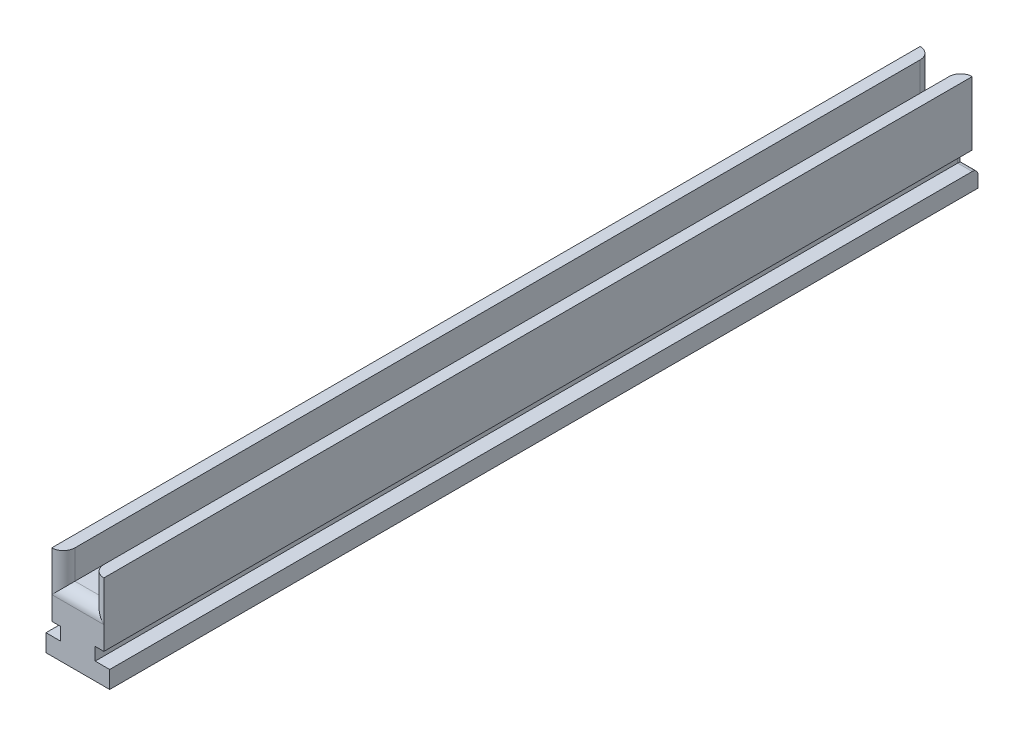
ISO-10303-21;
HEADER;
FILE_DESCRIPTION(('STEP AP214'),'2;1');
FILE_NAME('part.step','',(''),(''),'','','');
FILE_SCHEMA(('AUTOMOTIVE_DESIGN { 1 0 10303 214 1 1 1 1 }'));
ENDSEC;
DATA;
#1=APPLICATION_CONTEXT('core data for automotive mechanical design processes');
#2=APPLICATION_PROTOCOL_DEFINITION('international standard','automotive_design',2000,#1);
#3=PRODUCT_CONTEXT('',#1,'mechanical');
#4=PRODUCT('Part','Part','',(#3));
#5=PRODUCT_RELATED_PRODUCT_CATEGORY('part','',(#4));
#6=PRODUCT_DEFINITION_FORMATION('','',#4);
#7=PRODUCT_DEFINITION_CONTEXT('part definition',#1,'design');
#8=PRODUCT_DEFINITION('design','',#6,#7);
#9=PRODUCT_DEFINITION_SHAPE('','',#8);
#10=(LENGTH_UNIT() NAMED_UNIT(*) SI_UNIT(.MILLI.,.METRE.));
#11=(NAMED_UNIT(*) PLANE_ANGLE_UNIT() SI_UNIT($,.RADIAN.));
#12=(NAMED_UNIT(*) SI_UNIT($,.STERADIAN.) SOLID_ANGLE_UNIT());
#13=UNCERTAINTY_MEASURE_WITH_UNIT(LENGTH_MEASURE(1.E-05),#10,'distance_accuracy_value','');
#14=(GEOMETRIC_REPRESENTATION_CONTEXT(3) GLOBAL_UNCERTAINTY_ASSIGNED_CONTEXT((#13)) GLOBAL_UNIT_ASSIGNED_CONTEXT((#10,
#11,#12)) REPRESENTATION_CONTEXT('',''));
#15=CARTESIAN_POINT('',(0.,0.,0.));
#16=DIRECTION('',(0.,0.,1.));
#17=DIRECTION('',(1.,0.,0.));
#18=AXIS2_PLACEMENT_3D('',#15,#16,#17);
#19=CARTESIAN_POINT('',(3.,0.,150.));
#20=DIRECTION('',(1.,0.,0.));
#21=DIRECTION('',(0.,0.,-1.));
#22=AXIS2_PLACEMENT_3D('',#19,#20,#21);
#23=PLANE('',#22);
#24=DIRECTION('',(0.,0.,-1.));
#25=VECTOR('',#24,1.);
#26=CARTESIAN_POINT('',(3.,-2.2,150.));
#27=LINE('',#26,#25);
#28=CARTESIAN_POINT('',(3.,-2.2,150.));
#29=VERTEX_POINT('',#28);
#30=CARTESIAN_POINT('',(3.,-2.2,1.));
#31=VERTEX_POINT('',#30);
#32=EDGE_CURVE('E246',#29,#31,#27,.T.);
#33=ORIENTED_EDGE('',*,*,#32,.T.);
#34=DIRECTION('',(0.,-1.,0.));
#35=VECTOR('',#34,1.);
#36=CARTESIAN_POINT('',(3.,0.,1.));
#37=LINE('',#36,#35);
#38=CARTESIAN_POINT('',(3.,0.,1.));
#39=VERTEX_POINT('',#38);
#40=EDGE_CURVE('E52',#31,#39,#37,.F.);
#41=ORIENTED_EDGE('',*,*,#40,.T.);
#42=DIRECTION('',(0.,0.,-1.));
#43=VECTOR('',#42,1.);
#44=CARTESIAN_POINT('',(3.,0.,150.));
#45=LINE('',#44,#43);
#46=CARTESIAN_POINT('',(3.,0.,150.));
#47=VERTEX_POINT('',#46);
#48=EDGE_CURVE('E178',#47,#39,#45,.T.);
#49=ORIENTED_EDGE('',*,*,#48,.F.);
#50=DIRECTION('',(0.,-1.,0.));
#51=VECTOR('',#50,1.);
#52=CARTESIAN_POINT('',(3.,0.,150.));
#53=LINE('',#52,#51);
#54=EDGE_CURVE('E181',#47,#29,#53,.T.);
#55=ORIENTED_EDGE('',*,*,#54,.T.);
#56=EDGE_LOOP('',(#33,#41,#49,#55));
#57=FACE_BOUND('',#56,.T.);
#58=ADVANCED_FACE('F35',(#57),#23,.T.);
#59=CARTESIAN_POINT('',(0.,0.,150.));
#60=DIRECTION('',(0.,1.,0.));
#61=DIRECTION('',(0.,0.,1.));
#62=AXIS2_PLACEMENT_3D('',#59,#60,#61);
#63=PLANE('',#62);
#64=DIRECTION('',(1.,0.,0.));
#65=VECTOR('',#64,1.);
#66=CARTESIAN_POINT('',(0.,0.,0.));
#67=LINE('',#66,#65);
#68=CARTESIAN_POINT('',(2.,0.,0.));
#69=VERTEX_POINT('',#68);
#70=CARTESIAN_POINT('',(4.5,0.,0.));
#71=VERTEX_POINT('',#70);
#72=EDGE_CURVE('E228',#69,#71,#67,.T.);
#73=ORIENTED_EDGE('',*,*,#72,.T.);
#74=DIRECTION('',(0.,0.,-1.));
#75=VECTOR('',#74,1.);
#76=CARTESIAN_POINT('',(4.5,0.,150.));
#77=LINE('',#76,#75);
#78=CARTESIAN_POINT('',(4.5,0.,150.));
#79=VERTEX_POINT('',#78);
#80=EDGE_CURVE('E186',#79,#71,#77,.T.);
#81=ORIENTED_EDGE('',*,*,#80,.F.);
#82=DIRECTION('',(1.,0.,0.));
#83=VECTOR('',#82,1.);
#84=CARTESIAN_POINT('',(0.,0.,150.));
#85=LINE('',#84,#83);
#86=EDGE_CURVE('E189',#47,#79,#85,.T.);
#87=ORIENTED_EDGE('',*,*,#86,.F.);
#88=ORIENTED_EDGE('',*,*,#48,.T.);
#89=CARTESIAN_POINT('',(2.,0.,1.));
#90=DIRECTION('',(0.,1.,0.));
#91=DIRECTION('',(0.,0.,1.));
#92=AXIS2_PLACEMENT_3D('',#89,#90,#91);
#93=CIRCLE('',#92,1.);
#94=EDGE_CURVE('E11',#39,#69,#93,.T.);
#95=ORIENTED_EDGE('',*,*,#94,.T.);
#96=EDGE_LOOP('',(#73,#81,#87,#88,#95));
#97=FACE_BOUND('',#96,.T.);
#98=ADVANCED_FACE('F190',(#97),#63,.F.);
#99=CARTESIAN_POINT('',(4.5,0.,150.));
#100=DIRECTION('',(-1.,0.,0.));
#101=DIRECTION('',(0.,0.,1.));
#102=AXIS2_PLACEMENT_3D('',#99,#100,#101);
#103=PLANE('',#102);
#104=DIRECTION('',(0.,1.,0.));
#105=VECTOR('',#104,1.);
#106=CARTESIAN_POINT('',(4.5,0.,0.));
#107=LINE('',#106,#105);
#108=CARTESIAN_POINT('',(4.5,4.,0.));
#109=VERTEX_POINT('',#108);
#110=EDGE_CURVE('E232',#71,#109,#107,.T.);
#111=ORIENTED_EDGE('',*,*,#110,.T.);
#112=CARTESIAN_POINT('',(4.5,11.,0.));
#113=VERTEX_POINT('',#112);
#114=EDGE_CURVE('E230',#109,#113,#107,.T.);
#115=ORIENTED_EDGE('',*,*,#114,.T.);
#116=DIRECTION('',(0.,0.,-1.));
#117=VECTOR('',#116,1.);
#118=CARTESIAN_POINT('',(4.5,11.,150.));
#119=LINE('',#118,#117);
#120=CARTESIAN_POINT('',(4.5,11.,150.));
#121=VERTEX_POINT('',#120);
#122=EDGE_CURVE('E281',#121,#113,#119,.T.);
#123=ORIENTED_EDGE('',*,*,#122,.F.);
#124=DIRECTION('',(0.,1.,0.));
#125=VECTOR('',#124,1.);
#126=CARTESIAN_POINT('',(4.5,0.,150.));
#127=LINE('',#126,#125);
#128=CARTESIAN_POINT('',(4.5,4.,150.));
#129=VERTEX_POINT('',#128);
#130=EDGE_CURVE('E195',#129,#121,#127,.T.);
#131=ORIENTED_EDGE('',*,*,#130,.F.);
#132=EDGE_CURVE('E206',#79,#129,#127,.T.);
#133=ORIENTED_EDGE('',*,*,#132,.F.);
#134=ORIENTED_EDGE('',*,*,#80,.T.);
#135=EDGE_LOOP('',(#111,#115,#123,#131,#133,#134));
#136=FACE_BOUND('',#135,.T.);
#137=ADVANCED_FACE('F359',(#136),#103,.F.);
#138=CARTESIAN_POINT('',(0.,11.,150.));
#139=DIRECTION('',(0.,-1.,0.));
#140=DIRECTION('',(0.,0.,-1.));
#141=AXIS2_PLACEMENT_3D('',#138,#139,#140);
#142=PLANE('',#141);
#143=ORIENTED_EDGE('',*,*,#122,.T.);
#144=CARTESIAN_POINT('',(4.5,11.,2.));
#145=DIRECTION('',(0.,-1.,0.));
#146=DIRECTION('',(0.,0.,-1.));
#147=AXIS2_PLACEMENT_3D('',#144,#145,#146);
#148=CIRCLE('',#147,2.);
#149=CARTESIAN_POINT('',(2.5,11.,2.));
#150=VERTEX_POINT('',#149);
#151=EDGE_CURVE('E297',#113,#150,#148,.F.);
#152=ORIENTED_EDGE('',*,*,#151,.T.);
#153=DIRECTION('',(0.,0.,-1.));
#154=VECTOR('',#153,1.);
#155=CARTESIAN_POINT('',(2.5,11.,150.));
#156=LINE('',#155,#154);
#157=CARTESIAN_POINT('',(2.5,11.,148.));
#158=VERTEX_POINT('',#157);
#159=EDGE_CURVE('E278',#158,#150,#156,.T.);
#160=ORIENTED_EDGE('',*,*,#159,.F.);
#161=CARTESIAN_POINT('',(4.5,11.,148.));
#162=DIRECTION('',(0.,-1.,0.));
#163=DIRECTION('',(0.,0.,-1.));
#164=AXIS2_PLACEMENT_3D('',#161,#162,#163);
#165=CIRCLE('',#164,2.);
#166=EDGE_CURVE('E295',#158,#121,#165,.F.);
#167=ORIENTED_EDGE('',*,*,#166,.T.);
#168=EDGE_LOOP('',(#143,#152,#160,#167));
#169=FACE_BOUND('',#168,.T.);
#170=ADVANCED_FACE('F409',(#169),#142,.F.);
#171=CARTESIAN_POINT('',(2.5,0.,150.));
#172=DIRECTION('',(-1.,0.,0.));
#173=DIRECTION('',(0.,-1.,0.));
#174=AXIS2_PLACEMENT_3D('',#171,#172,#173);
#175=PLANE('',#174);
#176=ORIENTED_EDGE('',*,*,#159,.T.);
#177=DIRECTION('',(0.,1.,0.));
#178=VECTOR('',#177,1.);
#179=CARTESIAN_POINT('',(2.5,6.,2.));
#180=LINE('',#179,#178);
#181=CARTESIAN_POINT('',(2.5,6.,2.));
#182=VERTEX_POINT('',#181);
#183=EDGE_CURVE('E301',#150,#182,#180,.F.);
#184=ORIENTED_EDGE('',*,*,#183,.T.);
#185=DIRECTION('',(0.,0.,-1.));
#186=VECTOR('',#185,1.);
#187=CARTESIAN_POINT('',(2.5,6.,150.));
#188=LINE('',#187,#186);
#189=CARTESIAN_POINT('',(2.5,6.,148.));
#190=VERTEX_POINT('',#189);
#191=EDGE_CURVE('E275',#190,#182,#188,.T.);
#192=ORIENTED_EDGE('',*,*,#191,.F.);
#193=DIRECTION('',(0.,1.,0.));
#194=VECTOR('',#193,1.);
#195=CARTESIAN_POINT('',(2.5,0.,148.));
#196=LINE('',#195,#194);
#197=EDGE_CURVE('E299',#190,#158,#196,.T.);
#198=ORIENTED_EDGE('',*,*,#197,.T.);
#199=EDGE_LOOP('',(#176,#184,#192,#198));
#200=FACE_BOUND('',#199,.T.);
#201=ADVANCED_FACE('F400',(#200),#175,.T.);
#202=CARTESIAN_POINT('',(0.,6.,150.));
#203=DIRECTION('',(0.,1.,0.));
#204=DIRECTION('',(0.,0.,1.));
#205=AXIS2_PLACEMENT_3D('',#202,#203,#204);
#206=PLANE('',#205);
#207=ORIENTED_EDGE('',*,*,#191,.T.);
#208=DIRECTION('',(1.,0.,0.));
#209=VECTOR('',#208,1.);
#210=CARTESIAN_POINT('',(-2.5,6.,2.));
#211=LINE('',#210,#209);
#212=CARTESIAN_POINT('',(-2.5,6.,2.));
#213=VERTEX_POINT('',#212);
#214=EDGE_CURVE('E307',#182,#213,#211,.F.);
#215=ORIENTED_EDGE('',*,*,#214,.T.);
#216=DIRECTION('',(0.,0.,-1.));
#217=VECTOR('',#216,1.);
#218=CARTESIAN_POINT('',(-2.5,6.,150.));
#219=LINE('',#218,#217);
#220=CARTESIAN_POINT('',(-2.5,6.,148.));
#221=VERTEX_POINT('',#220);
#222=EDGE_CURVE('E272',#221,#213,#219,.T.);
#223=ORIENTED_EDGE('',*,*,#222,.F.);
#224=DIRECTION('',(1.,0.,0.));
#225=VECTOR('',#224,1.);
#226=CARTESIAN_POINT('',(0.,6.,148.));
#227=LINE('',#226,#225);
#228=EDGE_CURVE('E305',#221,#190,#227,.T.);
#229=ORIENTED_EDGE('',*,*,#228,.T.);
#230=EDGE_LOOP('',(#207,#215,#223,#229));
#231=FACE_BOUND('',#230,.T.);
#232=ADVANCED_FACE('F397',(#231),#206,.T.);
#233=CARTESIAN_POINT('',(-2.5,0.,150.));
#234=DIRECTION('',(-1.,0.,0.));
#235=DIRECTION('',(0.,-1.,0.));
#236=AXIS2_PLACEMENT_3D('',#233,#234,#235);
#237=PLANE('',#236);
#238=ORIENTED_EDGE('',*,*,#222,.T.);
#239=DIRECTION('',(0.,1.,0.));
#240=VECTOR('',#239,1.);
#241=CARTESIAN_POINT('',(-2.5,0.,2.));
#242=LINE('',#241,#240);
#243=CARTESIAN_POINT('',(-2.5,11.,2.));
#244=VERTEX_POINT('',#243);
#245=EDGE_CURVE('E286',#213,#244,#242,.T.);
#246=ORIENTED_EDGE('',*,*,#245,.T.);
#247=DIRECTION('',(0.,0.,-1.));
#248=VECTOR('',#247,1.);
#249=CARTESIAN_POINT('',(-2.5,11.,150.));
#250=LINE('',#249,#248);
#251=CARTESIAN_POINT('',(-2.5,11.,148.));
#252=VERTEX_POINT('',#251);
#253=EDGE_CURVE('E269',#252,#244,#250,.T.);
#254=ORIENTED_EDGE('',*,*,#253,.F.);
#255=DIRECTION('',(0.,1.,0.));
#256=VECTOR('',#255,1.);
#257=CARTESIAN_POINT('',(-2.5,6.,148.));
#258=LINE('',#257,#256);
#259=EDGE_CURVE('E185',#252,#221,#258,.F.);
#260=ORIENTED_EDGE('',*,*,#259,.T.);
#261=EDGE_LOOP('',(#238,#246,#254,#260));
#262=FACE_BOUND('',#261,.T.);
#263=ADVANCED_FACE('F375',(#262),#237,.F.);
#264=CARTESIAN_POINT('',(0.,11.,150.));
#265=DIRECTION('',(0.,1.,0.));
#266=DIRECTION('',(0.,0.,1.));
#267=AXIS2_PLACEMENT_3D('',#264,#265,#266);
#268=PLANE('',#267);
#269=ORIENTED_EDGE('',*,*,#253,.T.);
#270=CARTESIAN_POINT('',(-4.5,11.,2.));
#271=DIRECTION('',(0.,1.,0.));
#272=DIRECTION('',(0.,0.,1.));
#273=AXIS2_PLACEMENT_3D('',#270,#271,#272);
#274=CIRCLE('',#273,2.);
#275=CARTESIAN_POINT('',(-4.5,11.,0.));
#276=VERTEX_POINT('',#275);
#277=EDGE_CURVE('E291',#244,#276,#274,.T.);
#278=ORIENTED_EDGE('',*,*,#277,.T.);
#279=DIRECTION('',(0.,0.,-1.));
#280=VECTOR('',#279,1.);
#281=CARTESIAN_POINT('',(-4.5,11.,150.));
#282=LINE('',#281,#280);
#283=CARTESIAN_POINT('',(-4.5,11.,150.));
#284=VERTEX_POINT('',#283);
#285=EDGE_CURVE('E266',#284,#276,#282,.T.);
#286=ORIENTED_EDGE('',*,*,#285,.F.);
#287=CARTESIAN_POINT('',(-4.5,11.,148.));
#288=DIRECTION('',(0.,1.,0.));
#289=DIRECTION('',(0.,0.,1.));
#290=AXIS2_PLACEMENT_3D('',#287,#288,#289);
#291=CIRCLE('',#290,2.);
#292=EDGE_CURVE('E289',#284,#252,#291,.T.);
#293=ORIENTED_EDGE('',*,*,#292,.T.);
#294=EDGE_LOOP('',(#269,#278,#286,#293));
#295=FACE_BOUND('',#294,.T.);
#296=ADVANCED_FACE('F379',(#295),#268,.T.);
#297=CARTESIAN_POINT('',(-4.5,0.,150.));
#298=DIRECTION('',(-1.,0.,0.));
#299=DIRECTION('',(0.,0.,1.));
#300=AXIS2_PLACEMENT_3D('',#297,#298,#299);
#301=PLANE('',#300);
#302=DIRECTION('',(0.,1.,0.));
#303=VECTOR('',#302,1.);
#304=CARTESIAN_POINT('',(-4.5,0.,0.));
#305=LINE('',#304,#303);
#306=CARTESIAN_POINT('',(-4.5,0.,0.));
#307=VERTEX_POINT('',#306);
#308=CARTESIAN_POINT('',(-4.5,4.,0.));
#309=VERTEX_POINT('',#308);
#310=EDGE_CURVE('E236',#307,#309,#305,.T.);
#311=ORIENTED_EDGE('',*,*,#310,.F.);
#312=DIRECTION('',(0.,0.,-1.));
#313=VECTOR('',#312,1.);
#314=CARTESIAN_POINT('',(-4.5,0.,150.));
#315=LINE('',#314,#313);
#316=CARTESIAN_POINT('',(-4.5,0.,150.));
#317=VERTEX_POINT('',#316);
#318=EDGE_CURVE('E264',#317,#307,#315,.T.);
#319=ORIENTED_EDGE('',*,*,#318,.F.);
#320=DIRECTION('',(0.,1.,0.));
#321=VECTOR('',#320,1.);
#322=CARTESIAN_POINT('',(-4.5,0.,150.));
#323=LINE('',#322,#321);
#324=CARTESIAN_POINT('',(-4.5,4.,150.));
#325=VERTEX_POINT('',#324);
#326=EDGE_CURVE('E209',#317,#325,#323,.T.);
#327=ORIENTED_EDGE('',*,*,#326,.T.);
#328=EDGE_CURVE('E208',#325,#284,#323,.T.);
#329=ORIENTED_EDGE('',*,*,#328,.T.);
#330=ORIENTED_EDGE('',*,*,#285,.T.);
#331=EDGE_CURVE('E235',#309,#276,#305,.T.);
#332=ORIENTED_EDGE('',*,*,#331,.F.);
#333=EDGE_LOOP('',(#311,#319,#327,#329,#330,#332));
#334=FACE_BOUND('',#333,.T.);
#335=ADVANCED_FACE('F386',(#334),#301,.T.);
#336=CARTESIAN_POINT('',(0.,0.,150.));
#337=DIRECTION('',(0.,-1.,0.));
#338=DIRECTION('',(0.,0.,-1.));
#339=AXIS2_PLACEMENT_3D('',#336,#337,#338);
#340=PLANE('',#339);
#341=DIRECTION('',(-1.,0.,0.));
#342=VECTOR('',#341,1.);
#343=CARTESIAN_POINT('',(0.,0.,0.));
#344=LINE('',#343,#342);
#345=CARTESIAN_POINT('',(-2.,0.,0.));
#346=VERTEX_POINT('',#345);
#347=EDGE_CURVE('E239',#346,#307,#344,.T.);
#348=ORIENTED_EDGE('',*,*,#347,.F.);
#349=CARTESIAN_POINT('',(-2.,0.,1.));
#350=DIRECTION('',(0.,-1.,0.));
#351=DIRECTION('',(0.,0.,-1.));
#352=AXIS2_PLACEMENT_3D('',#349,#350,#351);
#353=CIRCLE('',#352,1.);
#354=CARTESIAN_POINT('',(-3.,0.,1.));
#355=VERTEX_POINT('',#354);
#356=EDGE_CURVE('E44',#346,#355,#353,.F.);
#357=ORIENTED_EDGE('',*,*,#356,.T.);
#358=DIRECTION('',(0.,0.,-1.));
#359=VECTOR('',#358,1.);
#360=CARTESIAN_POINT('',(-3.,0.,150.));
#361=LINE('',#360,#359);
#362=CARTESIAN_POINT('',(-3.,0.,150.));
#363=VERTEX_POINT('',#362);
#364=EDGE_CURVE('E262',#363,#355,#361,.T.);
#365=ORIENTED_EDGE('',*,*,#364,.F.);
#366=DIRECTION('',(-1.,0.,0.));
#367=VECTOR('',#366,1.);
#368=CARTESIAN_POINT('',(0.,0.,150.));
#369=LINE('',#368,#367);
#370=EDGE_CURVE('E212',#363,#317,#369,.T.);
#371=ORIENTED_EDGE('',*,*,#370,.T.);
#372=ORIENTED_EDGE('',*,*,#318,.T.);
#373=EDGE_LOOP('',(#348,#357,#365,#371,#372));
#374=FACE_BOUND('',#373,.T.);
#375=ADVANCED_FACE('F510',(#374),#340,.T.);
#376=CARTESIAN_POINT('',(-3.,0.,150.));
#377=DIRECTION('',(-1.,0.,0.));
#378=DIRECTION('',(0.,0.,1.));
#379=AXIS2_PLACEMENT_3D('',#376,#377,#378);
#380=PLANE('',#379);
#381=ORIENTED_EDGE('',*,*,#364,.T.);
#382=DIRECTION('',(0.,1.,0.));
#383=VECTOR('',#382,1.);
#384=CARTESIAN_POINT('',(-3.,-2.2,1.));
#385=LINE('',#384,#383);
#386=CARTESIAN_POINT('',(-3.,-2.2,1.));
#387=VERTEX_POINT('',#386);
#388=EDGE_CURVE('E340',#355,#387,#385,.F.);
#389=ORIENTED_EDGE('',*,*,#388,.T.);
#390=DIRECTION('',(0.,0.,-1.));
#391=VECTOR('',#390,1.);
#392=CARTESIAN_POINT('',(-3.,-2.2,150.));
#393=LINE('',#392,#391);
#394=CARTESIAN_POINT('',(-3.,-2.2,150.));
#395=VERTEX_POINT('',#394);
#396=EDGE_CURVE('E259',#395,#387,#393,.T.);
#397=ORIENTED_EDGE('',*,*,#396,.F.);
#398=DIRECTION('',(0.,1.,0.));
#399=VECTOR('',#398,1.);
#400=CARTESIAN_POINT('',(-3.,0.,150.));
#401=LINE('',#400,#399);
#402=EDGE_CURVE('E215',#395,#363,#401,.T.);
#403=ORIENTED_EDGE('',*,*,#402,.T.);
#404=EDGE_LOOP('',(#381,#389,#397,#403));
#405=FACE_BOUND('',#404,.T.);
#406=ADVANCED_FACE('F628',(#405),#380,.T.);
#407=CARTESIAN_POINT('',(0.,-2.2,150.));
#408=DIRECTION('',(0.,1.,0.));
#409=DIRECTION('',(-1.,0.,0.));
#410=AXIS2_PLACEMENT_3D('',#407,#408,#409);
#411=PLANE('',#410);
#412=ORIENTED_EDGE('',*,*,#396,.T.);
#413=DIRECTION('',(1.,0.,0.));
#414=VECTOR('',#413,1.);
#415=CARTESIAN_POINT('',(-5.5,-2.2,1.));
#416=LINE('',#415,#414);
#417=CARTESIAN_POINT('',(-5.5,-2.2,1.));
#418=VERTEX_POINT('',#417);
#419=EDGE_CURVE('E332',#387,#418,#416,.F.);
#420=ORIENTED_EDGE('',*,*,#419,.T.);
#421=DIRECTION('',(0.,0.,-1.));
#422=VECTOR('',#421,1.);
#423=CARTESIAN_POINT('',(-5.5,-2.2,150.));
#424=LINE('',#423,#422);
#425=CARTESIAN_POINT('',(-5.5,-2.2,150.));
#426=VERTEX_POINT('',#425);
#427=EDGE_CURVE('E256',#426,#418,#424,.T.);
#428=ORIENTED_EDGE('',*,*,#427,.F.);
#429=DIRECTION('',(1.,0.,0.));
#430=VECTOR('',#429,1.);
#431=CARTESIAN_POINT('',(0.,-2.2,150.));
#432=LINE('',#431,#430);
#433=EDGE_CURVE('E218',#426,#395,#432,.T.);
#434=ORIENTED_EDGE('',*,*,#433,.T.);
#435=EDGE_LOOP('',(#412,#420,#428,#434));
#436=FACE_BOUND('',#435,.T.);
#437=ADVANCED_FACE('F592',(#436),#411,.T.);
#438=CARTESIAN_POINT('',(-5.5,0.,150.));
#439=DIRECTION('',(-1.,0.,0.));
#440=DIRECTION('',(0.,0.,1.));
#441=AXIS2_PLACEMENT_3D('',#438,#439,#440);
#442=PLANE('',#441);
#443=ORIENTED_EDGE('',*,*,#427,.T.);
#444=CARTESIAN_POINT('',(-5.5,-3.2,1.));
#445=DIRECTION('',(-1.,0.,0.));
#446=DIRECTION('',(0.,0.,1.));
#447=AXIS2_PLACEMENT_3D('',#444,#445,#446);
#448=CIRCLE('',#447,1.);
#449=CARTESIAN_POINT('',(-5.5,-3.2,0.));
#450=VERTEX_POINT('',#449);
#451=EDGE_CURVE('E334',#418,#450,#448,.T.);
#452=ORIENTED_EDGE('',*,*,#451,.T.);
#453=DIRECTION('',(0.,1.,0.));
#454=VECTOR('',#453,1.);
#455=CARTESIAN_POINT('',(-5.5,0.,0.));
#456=LINE('',#455,#454);
#457=CARTESIAN_POINT('',(-5.5,-5.2,0.));
#458=VERTEX_POINT('',#457);
#459=EDGE_CURVE('E242',#458,#450,#456,.T.);
#460=ORIENTED_EDGE('',*,*,#459,.F.);
#461=DIRECTION('',(0.,0.,-1.));
#462=VECTOR('',#461,1.);
#463=CARTESIAN_POINT('',(-5.5,-5.2,150.));
#464=LINE('',#463,#462);
#465=CARTESIAN_POINT('',(-5.5,-5.2,150.));
#466=VERTEX_POINT('',#465);
#467=EDGE_CURVE('E254',#466,#458,#464,.T.);
#468=ORIENTED_EDGE('',*,*,#467,.F.);
#469=DIRECTION('',(0.,1.,0.));
#470=VECTOR('',#469,1.);
#471=CARTESIAN_POINT('',(-5.5,0.,150.));
#472=LINE('',#471,#470);
#473=EDGE_CURVE('E221',#466,#426,#472,.T.);
#474=ORIENTED_EDGE('',*,*,#473,.T.);
#475=EDGE_LOOP('',(#443,#452,#460,#468,#474));
#476=FACE_BOUND('',#475,.T.);
#477=ADVANCED_FACE('F570',(#476),#442,.T.);
#478=CARTESIAN_POINT('',(0.,-5.2,150.));
#479=DIRECTION('',(0.,1.,0.));
#480=DIRECTION('',(-1.,0.,0.));
#481=AXIS2_PLACEMENT_3D('',#478,#479,#480);
#482=PLANE('',#481);
#483=DIRECTION('',(1.,0.,0.));
#484=VECTOR('',#483,1.);
#485=CARTESIAN_POINT('',(0.,-5.2,0.));
#486=LINE('',#485,#484);
#487=CARTESIAN_POINT('',(5.5,-5.2,0.));
#488=VERTEX_POINT('',#487);
#489=EDGE_CURVE('E203',#458,#488,#486,.T.);
#490=ORIENTED_EDGE('',*,*,#489,.T.);
#491=DIRECTION('',(0.,0.,-1.));
#492=VECTOR('',#491,1.);
#493=CARTESIAN_POINT('',(5.5,-5.2,150.));
#494=LINE('',#493,#492);
#495=CARTESIAN_POINT('',(5.5,-5.2,150.));
#496=VERTEX_POINT('',#495);
#497=EDGE_CURVE('E251',#496,#488,#494,.T.);
#498=ORIENTED_EDGE('',*,*,#497,.F.);
#499=DIRECTION('',(1.,0.,0.));
#500=VECTOR('',#499,1.);
#501=CARTESIAN_POINT('',(0.,-5.2,150.));
#502=LINE('',#501,#500);
#503=EDGE_CURVE('E224',#466,#496,#502,.T.);
#504=ORIENTED_EDGE('',*,*,#503,.F.);
#505=ORIENTED_EDGE('',*,*,#467,.T.);
#506=EDGE_LOOP('',(#490,#498,#504,#505));
#507=FACE_BOUND('',#506,.T.);
#508=ADVANCED_FACE('F565',(#507),#482,.F.);
#509=CARTESIAN_POINT('',(5.5,0.,150.));
#510=DIRECTION('',(-1.,0.,0.));
#511=DIRECTION('',(0.,0.,1.));
#512=AXIS2_PLACEMENT_3D('',#509,#510,#511);
#513=PLANE('',#512);
#514=DIRECTION('',(0.,1.,0.));
#515=VECTOR('',#514,1.);
#516=CARTESIAN_POINT('',(5.5,0.,0.));
#517=LINE('',#516,#515);
#518=CARTESIAN_POINT('',(5.5,-3.2,0.));
#519=VERTEX_POINT('',#518);
#520=EDGE_CURVE('E200',#488,#519,#517,.T.);
#521=ORIENTED_EDGE('',*,*,#520,.T.);
#522=CARTESIAN_POINT('',(5.5,-3.2,1.));
#523=DIRECTION('',(-1.,0.,0.));
#524=DIRECTION('',(0.,0.,1.));
#525=AXIS2_PLACEMENT_3D('',#522,#523,#524);
#526=CIRCLE('',#525,1.);
#527=CARTESIAN_POINT('',(5.5,-2.2,1.));
#528=VERTEX_POINT('',#527);
#529=EDGE_CURVE('E336',#519,#528,#526,.F.);
#530=ORIENTED_EDGE('',*,*,#529,.T.);
#531=DIRECTION('',(0.,0.,-1.));
#532=VECTOR('',#531,1.);
#533=CARTESIAN_POINT('',(5.5,-2.2,150.));
#534=LINE('',#533,#532);
#535=CARTESIAN_POINT('',(5.5,-2.2,150.));
#536=VERTEX_POINT('',#535);
#537=EDGE_CURVE('E248',#536,#528,#534,.T.);
#538=ORIENTED_EDGE('',*,*,#537,.F.);
#539=DIRECTION('',(0.,1.,0.));
#540=VECTOR('',#539,1.);
#541=CARTESIAN_POINT('',(5.5,0.,150.));
#542=LINE('',#541,#540);
#543=EDGE_CURVE('E226',#496,#536,#542,.T.);
#544=ORIENTED_EDGE('',*,*,#543,.F.);
#545=ORIENTED_EDGE('',*,*,#497,.T.);
#546=EDGE_LOOP('',(#521,#530,#538,#544,#545));
#547=FACE_BOUND('',#546,.T.);
#548=ADVANCED_FACE('F569',(#547),#513,.F.);
#549=ORIENTED_EDGE('',*,*,#537,.T.);
#550=DIRECTION('',(1.,0.,0.));
#551=VECTOR('',#550,1.);
#552=CARTESIAN_POINT('',(3.,-2.2,1.));
#553=LINE('',#552,#551);
#554=EDGE_CURVE('E338',#528,#31,#553,.F.);
#555=ORIENTED_EDGE('',*,*,#554,.T.);
#556=ORIENTED_EDGE('',*,*,#32,.F.);
#557=EDGE_CURVE('E199',#29,#536,#432,.T.);
#558=ORIENTED_EDGE('',*,*,#557,.T.);
#559=EDGE_LOOP('',(#549,#555,#556,#558));
#560=FACE_BOUND('',#559,.T.);
#561=ADVANCED_FACE('F498',(#560),#411,.T.);
#562=CARTESIAN_POINT('',(0.,0.,150.));
#563=DIRECTION('',(0.,0.,1.));
#564=DIRECTION('',(1.,0.,0.));
#565=AXIS2_PLACEMENT_3D('',#562,#563,#564);
#566=PLANE('',#565);
#567=ORIENTED_EDGE('',*,*,#132,.T.);
#568=DIRECTION('',(1.,0.,0.));
#569=VECTOR('',#568,1.);
#570=CARTESIAN_POINT('',(0.,4.,150.));
#571=LINE('',#570,#569);
#572=EDGE_CURVE('E303',#129,#325,#571,.F.);
#573=ORIENTED_EDGE('',*,*,#572,.T.);
#574=ORIENTED_EDGE('',*,*,#326,.F.);
#575=ORIENTED_EDGE('',*,*,#370,.F.);
#576=ORIENTED_EDGE('',*,*,#402,.F.);
#577=ORIENTED_EDGE('',*,*,#433,.F.);
#578=ORIENTED_EDGE('',*,*,#473,.F.);
#579=ORIENTED_EDGE('',*,*,#503,.T.);
#580=ORIENTED_EDGE('',*,*,#543,.T.);
#581=ORIENTED_EDGE('',*,*,#557,.F.);
#582=ORIENTED_EDGE('',*,*,#54,.F.);
#583=ORIENTED_EDGE('',*,*,#86,.T.);
#584=EDGE_LOOP('',(#567,#573,#574,#575,#576,#577,#578,#579,#580,#581,#582,#583));
#585=FACE_BOUND('',#584,.T.);
#586=ADVANCED_FACE('F197',(#585),#566,.T.);
#587=CARTESIAN_POINT('',(0.,0.,0.));
#588=DIRECTION('',(0.,0.,1.));
#589=DIRECTION('',(1.,0.,0.));
#590=AXIS2_PLACEMENT_3D('',#587,#588,#589);
#591=PLANE('',#590);
#592=ORIENTED_EDGE('',*,*,#459,.T.);
#593=DIRECTION('',(1.,0.,0.));
#594=VECTOR('',#593,1.);
#595=CARTESIAN_POINT('',(-3.,-3.2,0.));
#596=LINE('',#595,#594);
#597=CARTESIAN_POINT('',(-2.,-3.2,0.));
#598=VERTEX_POINT('',#597);
#599=EDGE_CURVE('E329',#450,#598,#596,.T.);
#600=ORIENTED_EDGE('',*,*,#599,.T.);
#601=DIRECTION('',(0.,1.,0.));
#602=VECTOR('',#601,1.);
#603=CARTESIAN_POINT('',(-2.,0.,0.));
#604=LINE('',#603,#602);
#605=EDGE_CURVE('E326',#598,#346,#604,.T.);
#606=ORIENTED_EDGE('',*,*,#605,.T.);
#607=ORIENTED_EDGE('',*,*,#347,.T.);
#608=ORIENTED_EDGE('',*,*,#310,.T.);
#609=DIRECTION('',(1.,0.,0.));
#610=VECTOR('',#609,1.);
#611=CARTESIAN_POINT('',(2.5,4.,0.));
#612=LINE('',#611,#610);
#613=EDGE_CURVE('E293',#309,#109,#612,.T.);
#614=ORIENTED_EDGE('',*,*,#613,.T.);
#615=ORIENTED_EDGE('',*,*,#110,.F.);
#616=ORIENTED_EDGE('',*,*,#72,.F.);
#617=DIRECTION('',(0.,-1.,0.));
#618=VECTOR('',#617,1.);
#619=CARTESIAN_POINT('',(2.,-2.2,0.));
#620=LINE('',#619,#618);
#621=CARTESIAN_POINT('',(2.,-3.2,0.));
#622=VERTEX_POINT('',#621);
#623=EDGE_CURVE('E309',#69,#622,#620,.T.);
#624=ORIENTED_EDGE('',*,*,#623,.T.);
#625=DIRECTION('',(1.,0.,0.));
#626=VECTOR('',#625,1.);
#627=CARTESIAN_POINT('',(5.5,-3.2,0.));
#628=LINE('',#627,#626);
#629=EDGE_CURVE('E323',#622,#519,#628,.T.);
#630=ORIENTED_EDGE('',*,*,#629,.T.);
#631=ORIENTED_EDGE('',*,*,#520,.F.);
#632=ORIENTED_EDGE('',*,*,#489,.F.);
#633=EDGE_LOOP('',(#592,#600,#606,#607,#608,#614,#615,#616,#624,#630,#631,#632));
#634=FACE_BOUND('',#633,.T.);
#635=ADVANCED_FACE('F361',(#634),#591,.F.);
#636=CARTESIAN_POINT('',(4.5,0.,2.));
#637=DIRECTION('',(0.,-1.,0.));
#638=DIRECTION('',(1.,0.,0.));
#639=AXIS2_PLACEMENT_3D('',#636,#637,#638);
#640=CYLINDRICAL_SURFACE('',#639,2.);
#641=ORIENTED_EDGE('',*,*,#151,.F.);
#642=ORIENTED_EDGE('',*,*,#114,.F.);
#643=CARTESIAN_POINT('',(4.5,4.,2.));
#644=DIRECTION('',(-0.707106781186547,-0.707106781186547,0.));
#645=DIRECTION('',(0.707106781186547,-0.707106781186547,0.));
#646=AXIS2_PLACEMENT_3D('',#643,#644,#645);
#647=ELLIPSE('',#646,2.82842712474619,2.);
#648=EDGE_CURVE('E231',#182,#109,#647,.T.);
#649=ORIENTED_EDGE('',*,*,#648,.F.);
#650=ORIENTED_EDGE('',*,*,#183,.F.);
#651=EDGE_LOOP('',(#641,#642,#649,#650));
#652=FACE_BOUND('',#651,.T.);
#653=ADVANCED_FACE('F412',(#652),#640,.T.);
#654=CARTESIAN_POINT('',(0.,4.,2.));
#655=DIRECTION('',(-1.,0.,0.));
#656=DIRECTION('',(0.,0.,1.));
#657=AXIS2_PLACEMENT_3D('',#654,#655,#656);
#658=CYLINDRICAL_SURFACE('',#657,2.);
#659=ORIENTED_EDGE('',*,*,#648,.T.);
#660=ORIENTED_EDGE('',*,*,#613,.F.);
#661=CARTESIAN_POINT('',(-4.5,4.,2.));
#662=DIRECTION('',(-0.707106781186547,0.707106781186547,0.));
#663=DIRECTION('',(0.707106781186547,0.707106781186547,0.));
#664=AXIS2_PLACEMENT_3D('',#661,#662,#663);
#665=ELLIPSE('',#664,2.82842712474619,2.);
#666=EDGE_CURVE('E310',#213,#309,#665,.T.);
#667=ORIENTED_EDGE('',*,*,#666,.F.);
#668=ORIENTED_EDGE('',*,*,#214,.F.);
#669=EDGE_LOOP('',(#659,#660,#667,#668));
#670=FACE_BOUND('',#669,.T.);
#671=ADVANCED_FACE('F366',(#670),#658,.T.);
#672=CARTESIAN_POINT('',(-4.5,0.,2.));
#673=DIRECTION('',(0.,1.,0.));
#674=DIRECTION('',(-1.,0.,0.));
#675=AXIS2_PLACEMENT_3D('',#672,#673,#674);
#676=CYLINDRICAL_SURFACE('',#675,2.);
#677=ORIENTED_EDGE('',*,*,#666,.T.);
#678=ORIENTED_EDGE('',*,*,#331,.T.);
#679=ORIENTED_EDGE('',*,*,#277,.F.);
#680=ORIENTED_EDGE('',*,*,#245,.F.);
#681=EDGE_LOOP('',(#677,#678,#679,#680));
#682=FACE_BOUND('',#681,.T.);
#683=ADVANCED_FACE('F372',(#682),#676,.T.);
#684=CARTESIAN_POINT('',(4.5,0.,148.));
#685=DIRECTION('',(0.,1.,0.));
#686=DIRECTION('',(-1.,0.,0.));
#687=AXIS2_PLACEMENT_3D('',#684,#685,#686);
#688=CYLINDRICAL_SURFACE('',#687,2.);
#689=ORIENTED_EDGE('',*,*,#166,.F.);
#690=ORIENTED_EDGE('',*,*,#197,.F.);
#691=CARTESIAN_POINT('',(4.5,4.,148.));
#692=DIRECTION('',(0.707106781186547,0.707106781186547,0.));
#693=DIRECTION('',(-0.707106781186547,0.707106781186547,0.));
#694=AXIS2_PLACEMENT_3D('',#691,#692,#693);
#695=ELLIPSE('',#694,2.82842712474619,2.);
#696=EDGE_CURVE('E313',#129,#190,#695,.F.);
#697=ORIENTED_EDGE('',*,*,#696,.F.);
#698=ORIENTED_EDGE('',*,*,#130,.T.);
#699=EDGE_LOOP('',(#689,#690,#697,#698));
#700=FACE_BOUND('',#699,.T.);
#701=ADVANCED_FACE('F405',(#700),#688,.T.);
#702=CARTESIAN_POINT('',(0.,4.,148.));
#703=DIRECTION('',(1.,0.,0.));
#704=DIRECTION('',(0.,0.,-1.));
#705=AXIS2_PLACEMENT_3D('',#702,#703,#704);
#706=CYLINDRICAL_SURFACE('',#705,2.);
#707=ORIENTED_EDGE('',*,*,#696,.T.);
#708=ORIENTED_EDGE('',*,*,#228,.F.);
#709=CARTESIAN_POINT('',(-4.5,4.,148.));
#710=DIRECTION('',(0.707106781186547,-0.707106781186547,0.));
#711=DIRECTION('',(-0.707106781186547,-0.707106781186547,0.));
#712=AXIS2_PLACEMENT_3D('',#709,#710,#711);
#713=ELLIPSE('',#712,2.82842712474619,2.);
#714=EDGE_CURVE('E316',#325,#221,#713,.F.);
#715=ORIENTED_EDGE('',*,*,#714,.F.);
#716=ORIENTED_EDGE('',*,*,#572,.F.);
#717=EDGE_LOOP('',(#707,#708,#715,#716));
#718=FACE_BOUND('',#717,.T.);
#719=ADVANCED_FACE('F393',(#718),#706,.T.);
#720=CARTESIAN_POINT('',(-4.5,0.,148.));
#721=DIRECTION('',(0.,-1.,0.));
#722=DIRECTION('',(1.,0.,0.));
#723=AXIS2_PLACEMENT_3D('',#720,#721,#722);
#724=CYLINDRICAL_SURFACE('',#723,2.);
#725=ORIENTED_EDGE('',*,*,#714,.T.);
#726=ORIENTED_EDGE('',*,*,#259,.F.);
#727=ORIENTED_EDGE('',*,*,#292,.F.);
#728=ORIENTED_EDGE('',*,*,#328,.F.);
#729=EDGE_LOOP('',(#725,#726,#727,#728));
#730=FACE_BOUND('',#729,.T.);
#731=ADVANCED_FACE('F384',(#730),#724,.T.);
#732=CARTESIAN_POINT('',(-2.,0.,1.));
#733=DIRECTION('',(0.,-1.,0.));
#734=DIRECTION('',(0.,0.,-1.));
#735=AXIS2_PLACEMENT_3D('',#732,#733,#734);
#736=CYLINDRICAL_SURFACE('',#735,1.);
#737=ORIENTED_EDGE('',*,*,#356,.F.);
#738=ORIENTED_EDGE('',*,*,#605,.F.);
#739=CARTESIAN_POINT('',(-2.,-3.2,1.));
#740=DIRECTION('',(-0.707106781186548,-0.707106781186547,0.));
#741=DIRECTION('',(-0.707106781186547,0.707106781186548,0.));
#742=AXIS2_PLACEMENT_3D('',#739,#740,#741);
#743=ELLIPSE('',#742,1.4142135623731,1.);
#744=EDGE_CURVE('E319',#387,#598,#743,.T.);
#745=ORIENTED_EDGE('',*,*,#744,.F.);
#746=ORIENTED_EDGE('',*,*,#388,.F.);
#747=EDGE_LOOP('',(#737,#738,#745,#746));
#748=FACE_BOUND('',#747,.T.);
#749=ADVANCED_FACE('F443',(#748),#736,.T.);
#750=CARTESIAN_POINT('',(0.,-3.2,1.));
#751=DIRECTION('',(-1.,0.,0.));
#752=DIRECTION('',(0.,-1.,0.));
#753=AXIS2_PLACEMENT_3D('',#750,#751,#752);
#754=CYLINDRICAL_SURFACE('',#753,1.);
#755=ORIENTED_EDGE('',*,*,#451,.F.);
#756=ORIENTED_EDGE('',*,*,#419,.F.);
#757=ORIENTED_EDGE('',*,*,#744,.T.);
#758=ORIENTED_EDGE('',*,*,#599,.F.);
#759=EDGE_LOOP('',(#755,#756,#757,#758));
#760=FACE_BOUND('',#759,.T.);
#761=ADVANCED_FACE('F440',(#760),#754,.T.);
#762=CARTESIAN_POINT('',(2.,0.,1.));
#763=DIRECTION('',(0.,1.,0.));
#764=DIRECTION('',(0.,0.,1.));
#765=AXIS2_PLACEMENT_3D('',#762,#763,#764);
#766=CYLINDRICAL_SURFACE('',#765,1.);
#767=ORIENTED_EDGE('',*,*,#94,.F.);
#768=ORIENTED_EDGE('',*,*,#40,.F.);
#769=CARTESIAN_POINT('',(2.,-3.2,1.));
#770=DIRECTION('',(-0.707106781186547,0.707106781186548,0.));
#771=DIRECTION('',(-0.707106781186548,-0.707106781186547,0.));
#772=AXIS2_PLACEMENT_3D('',#769,#770,#771);
#773=ELLIPSE('',#772,1.41421356237309,1.);
#774=EDGE_CURVE('E39',#622,#31,#773,.F.);
#775=ORIENTED_EDGE('',*,*,#774,.F.);
#776=ORIENTED_EDGE('',*,*,#623,.F.);
#777=EDGE_LOOP('',(#767,#768,#775,#776));
#778=FACE_BOUND('',#777,.T.);
#779=ADVANCED_FACE('F37',(#778),#766,.T.);
#780=CARTESIAN_POINT('',(0.,-3.2,1.));
#781=DIRECTION('',(-1.,0.,0.));
#782=DIRECTION('',(0.,-1.,0.));
#783=AXIS2_PLACEMENT_3D('',#780,#781,#782);
#784=CYLINDRICAL_SURFACE('',#783,1.);
#785=ORIENTED_EDGE('',*,*,#774,.T.);
#786=ORIENTED_EDGE('',*,*,#554,.F.);
#787=ORIENTED_EDGE('',*,*,#529,.F.);
#788=ORIENTED_EDGE('',*,*,#629,.F.);
#789=EDGE_LOOP('',(#785,#786,#787,#788));
#790=FACE_BOUND('',#789,.T.);
#791=ADVANCED_FACE('F353',(#790),#784,.T.);
#792=CLOSED_SHELL('',(#58,#98,#137,#170,#201,#232,#263,#296,#335,#375,#406,#437,#477,#508,#548,
#561,#586,#635,#653,#671,#683,#701,#719,#731,#749,#761,#779,#791));
#793=MANIFOLD_SOLID_BREP('B2',#792);
#794=ADVANCED_BREP_SHAPE_REPRESENTATION('',(#18,#793),#14);
#795=SHAPE_DEFINITION_REPRESENTATION(#9,#794);
ENDSEC;
END-ISO-10303-21;
